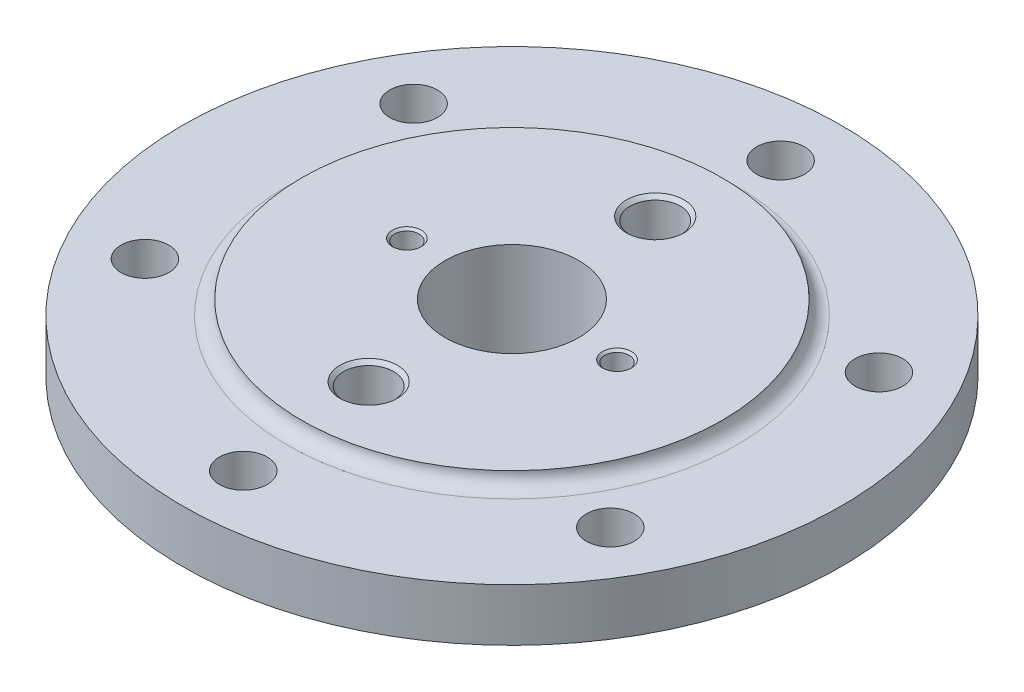
ISO-10303-21;
HEADER;
FILE_DESCRIPTION(('STEP AP214'),'2;1');
FILE_NAME('part.step','',(''),(''),'','','');
FILE_SCHEMA(('AUTOMOTIVE_DESIGN { 1 0 10303 214 1 1 1 1 }'));
ENDSEC;
DATA;
#1=APPLICATION_CONTEXT('core data for automotive mechanical design processes');
#2=APPLICATION_PROTOCOL_DEFINITION('international standard','automotive_design',2000,#1);
#3=PRODUCT_CONTEXT('',#1,'mechanical');
#4=PRODUCT('Part','Part','',(#3));
#5=PRODUCT_RELATED_PRODUCT_CATEGORY('part','',(#4));
#6=PRODUCT_DEFINITION_FORMATION('','',#4);
#7=PRODUCT_DEFINITION_CONTEXT('part definition',#1,'design');
#8=PRODUCT_DEFINITION('design','',#6,#7);
#9=PRODUCT_DEFINITION_SHAPE('','',#8);
#10=(LENGTH_UNIT() NAMED_UNIT(*) SI_UNIT(.MILLI.,.METRE.));
#11=(NAMED_UNIT(*) PLANE_ANGLE_UNIT() SI_UNIT($,.RADIAN.));
#12=(NAMED_UNIT(*) SI_UNIT($,.STERADIAN.) SOLID_ANGLE_UNIT());
#13=UNCERTAINTY_MEASURE_WITH_UNIT(LENGTH_MEASURE(1.E-05),#10,'distance_accuracy_value','');
#14=(GEOMETRIC_REPRESENTATION_CONTEXT(3) GLOBAL_UNCERTAINTY_ASSIGNED_CONTEXT((#13)) GLOBAL_UNIT_ASSIGNED_CONTEXT((#10,
#11,#12)) REPRESENTATION_CONTEXT('',''));
#15=CARTESIAN_POINT('',(0.,0.,0.));
#16=DIRECTION('',(0.,0.,1.));
#17=DIRECTION('',(1.,0.,0.));
#18=AXIS2_PLACEMENT_3D('',#15,#16,#17);
#19=CARTESIAN_POINT('',(-29.6935483870968,-6.7741935483871,0.));
#20=DIRECTION('',(0.,1.,0.));
#21=DIRECTION('',(-1.,0.,0.));
#22=AXIS2_PLACEMENT_3D('',#19,#20,#21);
#23=CONICAL_SURFACE('',#22,35.,0.774645889606347);
#24=CARTESIAN_POINT('',(-29.6935483870968,40.2258064516129,0.));
#25=DIRECTION('',(0.,1.,0.));
#26=DIRECTION('',(-1.,0.,0.));
#27=AXIS2_PLACEMENT_3D('',#24,#25,#26);
#28=CIRCLE('',#27,81.);
#29=CARTESIAN_POINT('',(-110.693548387097,40.2258064516129,0.));
#30=VERTEX_POINT('',#29);
#31=EDGE_CURVE('E11',#30,#30,#28,.T.);
#32=ORIENTED_EDGE('',*,*,#31,.F.);
#33=EDGE_LOOP('',(#32));
#34=FACE_BOUND('',#33,.T.);
#35=CARTESIAN_POINT('',(-29.6935483870968,-6.7741935483871,0.));
#36=DIRECTION('',(0.,1.,0.));
#37=DIRECTION('',(-1.,0.,0.));
#38=AXIS2_PLACEMENT_3D('',#35,#36,#37);
#39=CIRCLE('',#38,35.);
#40=CARTESIAN_POINT('',(-64.6935483870968,-6.77419354838711,0.));
#41=VERTEX_POINT('',#40);
#42=EDGE_CURVE('E139',#41,#41,#39,.T.);
#43=ORIENTED_EDGE('',*,*,#42,.T.);
#44=EDGE_LOOP('',(#43));
#45=FACE_BOUND('',#44,.T.);
#46=ADVANCED_FACE('F39',(#34,#45),#23,.T.);
#47=CARTESIAN_POINT('',(-29.6935483870968,26.3629032258064,0.));
#48=DIRECTION('',(0.,1.,0.));
#49=DIRECTION('',(-1.,0.,0.));
#50=AXIS2_PLACEMENT_3D('',#47,#48,#49);
#51=CYLINDRICAL_SURFACE('',#50,81.);
#52=CARTESIAN_POINT('',(-29.6935483870968,46.2258064516129,0.));
#53=DIRECTION('',(0.,1.,0.));
#54=DIRECTION('',(-1.,0.,0.));
#55=AXIS2_PLACEMENT_3D('',#52,#53,#54);
#56=CIRCLE('',#55,81.);
#57=CARTESIAN_POINT('',(-110.693548387097,46.2258064516129,0.));
#58=VERTEX_POINT('',#57);
#59=EDGE_CURVE('E46',#58,#58,#56,.T.);
#60=ORIENTED_EDGE('',*,*,#59,.F.);
#61=EDGE_LOOP('',(#60));
#62=FACE_BOUND('',#61,.T.);
#63=ORIENTED_EDGE('',*,*,#31,.T.);
#64=EDGE_LOOP('',(#63));
#65=FACE_BOUND('',#64,.T.);
#66=ADVANCED_FACE('F170',(#62,#65),#51,.T.);
#67=CARTESIAN_POINT('',(108.306451612903,46.2258064516129,0.));
#68=DIRECTION('',(0.,1.,0.));
#69=DIRECTION('',(-1.,0.,0.));
#70=AXIS2_PLACEMENT_3D('',#67,#68,#69);
#71=PLANE('',#70);
#72=CARTESIAN_POINT('',(-29.6935483870968,46.2258064516129,-112.5));
#73=DIRECTION('',(0.,1.,0.));
#74=DIRECTION('',(-1.,0.,0.));
#75=AXIS2_PLACEMENT_3D('',#72,#73,#74);
#76=CIRCLE('',#75,10.);
#77=CARTESIAN_POINT('',(-39.6935483870968,46.2258064516129,-112.5));
#78=VERTEX_POINT('',#77);
#79=EDGE_CURVE('E136',#78,#78,#76,.T.);
#80=ORIENTED_EDGE('',*,*,#79,.T.);
#81=EDGE_LOOP('',(#80));
#82=FACE_BOUND('',#81,.T.);
#83=CARTESIAN_POINT('',(-127.121406312844,46.2258064516129,-56.2499999999984));
#84=DIRECTION('',(0.,1.,0.));
#85=DIRECTION('',(-1.,0.,0.));
#86=AXIS2_PLACEMENT_3D('',#83,#84,#85);
#87=CIRCLE('',#86,9.99999999999998);
#88=CARTESIAN_POINT('',(-137.121406312844,46.2258064516129,-56.2499999999984));
#89=VERTEX_POINT('',#88);
#90=EDGE_CURVE('E133',#89,#89,#87,.T.);
#91=ORIENTED_EDGE('',*,*,#90,.T.);
#92=EDGE_LOOP('',(#91));
#93=FACE_BOUND('',#92,.T.);
#94=CARTESIAN_POINT('',(-127.121406312842,46.2258064516129,56.2500000000018));
#95=DIRECTION('',(0.,1.,0.));
#96=DIRECTION('',(-1.,0.,0.));
#97=AXIS2_PLACEMENT_3D('',#94,#95,#96);
#98=CIRCLE('',#97,10.);
#99=CARTESIAN_POINT('',(-137.121406312842,46.2258064516129,56.2500000000018));
#100=VERTEX_POINT('',#99);
#101=EDGE_CURVE('E130',#100,#100,#98,.T.);
#102=ORIENTED_EDGE('',*,*,#101,.T.);
#103=EDGE_LOOP('',(#102));
#104=FACE_BOUND('',#103,.T.);
#105=CARTESIAN_POINT('',(-29.6935483870912,46.2258064516129,112.5));
#106=DIRECTION('',(0.,1.,0.));
#107=DIRECTION('',(-1.,0.,0.));
#108=AXIS2_PLACEMENT_3D('',#105,#106,#107);
#109=CIRCLE('',#108,9.99999999999999);
#110=CARTESIAN_POINT('',(-39.6935483870912,46.2258064516129,112.5));
#111=VERTEX_POINT('',#110);
#112=EDGE_CURVE('E127',#111,#111,#109,.T.);
#113=ORIENTED_EDGE('',*,*,#112,.T.);
#114=EDGE_LOOP('',(#113));
#115=FACE_BOUND('',#114,.T.);
#116=CARTESIAN_POINT('',(67.7343095386571,46.2258064516129,56.2499999999977));
#117=DIRECTION('',(0.,1.,0.));
#118=DIRECTION('',(-1.,0.,0.));
#119=AXIS2_PLACEMENT_3D('',#116,#117,#118);
#120=CIRCLE('',#119,9.99999999999999);
#121=CARTESIAN_POINT('',(57.7343095386571,46.2258064516129,56.2499999999977));
#122=VERTEX_POINT('',#121);
#123=EDGE_CURVE('E124',#122,#122,#120,.T.);
#124=ORIENTED_EDGE('',*,*,#123,.T.);
#125=EDGE_LOOP('',(#124));
#126=FACE_BOUND('',#125,.T.);
#127=CARTESIAN_POINT('',(67.7343095386543,46.2258064516129,-56.2500000000025));
#128=DIRECTION('',(0.,1.,0.));
#129=DIRECTION('',(-1.,0.,0.));
#130=AXIS2_PLACEMENT_3D('',#127,#128,#129);
#131=CIRCLE('',#130,9.99999999999999);
#132=CARTESIAN_POINT('',(57.7343095386543,46.2258064516129,-56.2500000000025));
#133=VERTEX_POINT('',#132);
#134=EDGE_CURVE('E107',#133,#133,#131,.T.);
#135=ORIENTED_EDGE('',*,*,#134,.T.);
#136=EDGE_LOOP('',(#135));
#137=FACE_BOUND('',#136,.T.);
#138=CARTESIAN_POINT('',(-29.6935483870968,46.2258064516129,0.));
#139=DIRECTION('',(0.,1.,0.));
#140=DIRECTION('',(-1.,0.,0.));
#141=AXIS2_PLACEMENT_3D('',#138,#139,#140);
#142=CIRCLE('',#141,138.);
#143=CARTESIAN_POINT('',(-167.693548387097,46.2258064516129,0.));
#144=VERTEX_POINT('',#143);
#145=EDGE_CURVE('E163',#144,#144,#142,.T.);
#146=ORIENTED_EDGE('',*,*,#145,.F.);
#147=EDGE_LOOP('',(#146));
#148=FACE_BOUND('',#147,.T.);
#149=ORIENTED_EDGE('',*,*,#59,.T.);
#150=EDGE_LOOP('',(#149));
#151=FACE_BOUND('',#150,.T.);
#152=ADVANCED_FACE('F168',(#82,#93,#104,#115,#126,#137,#148,#151),#71,.F.);
#153=CARTESIAN_POINT('',(-29.6935483870968,26.3629032258064,0.));
#154=DIRECTION('',(0.,1.,0.));
#155=DIRECTION('',(-1.,0.,0.));
#156=AXIS2_PLACEMENT_3D('',#153,#154,#155);
#157=CYLINDRICAL_SURFACE('',#156,138.);
#158=CARTESIAN_POINT('',(-29.6935483870968,68.2258064516129,0.));
#159=DIRECTION('',(0.,1.,0.));
#160=DIRECTION('',(-1.,0.,0.));
#161=AXIS2_PLACEMENT_3D('',#158,#159,#160);
#162=CIRCLE('',#161,138.);
#163=CARTESIAN_POINT('',(-167.693548387097,68.2258064516129,0.));
#164=VERTEX_POINT('',#163);
#165=EDGE_CURVE('E160',#164,#164,#162,.T.);
#166=ORIENTED_EDGE('',*,*,#165,.F.);
#167=EDGE_LOOP('',(#166));
#168=FACE_BOUND('',#167,.T.);
#169=ORIENTED_EDGE('',*,*,#145,.T.);
#170=EDGE_LOOP('',(#169));
#171=FACE_BOUND('',#170,.T.);
#172=ADVANCED_FACE('F220',(#168,#171),#157,.T.);
#173=CARTESIAN_POINT('',(64.3064516129032,68.2258064516129,0.));
#174=DIRECTION('',(0.,-1.,0.));
#175=DIRECTION('',(1.,0.,0.));
#176=AXIS2_PLACEMENT_3D('',#173,#174,#175);
#177=PLANE('',#176);
#178=CARTESIAN_POINT('',(-29.6935483870968,68.2258064516129,-112.5));
#179=DIRECTION('',(0.,1.,0.));
#180=DIRECTION('',(-1.,0.,0.));
#181=AXIS2_PLACEMENT_3D('',#178,#179,#180);
#182=CIRCLE('',#181,10.);
#183=CARTESIAN_POINT('',(-39.6935483870968,68.2258064516129,-112.5));
#184=VERTEX_POINT('',#183);
#185=EDGE_CURVE('E104',#184,#184,#182,.T.);
#186=ORIENTED_EDGE('',*,*,#185,.F.);
#187=EDGE_LOOP('',(#186));
#188=FACE_BOUND('',#187,.T.);
#189=CARTESIAN_POINT('',(-127.121406312844,68.2258064516129,-56.2499999999984));
#190=DIRECTION('',(0.,1.,0.));
#191=DIRECTION('',(-1.,0.,0.));
#192=AXIS2_PLACEMENT_3D('',#189,#190,#191);
#193=CIRCLE('',#192,9.99999999999998);
#194=CARTESIAN_POINT('',(-137.121406312844,68.2258064516129,-56.2499999999984));
#195=VERTEX_POINT('',#194);
#196=EDGE_CURVE('E103',#195,#195,#193,.T.);
#197=ORIENTED_EDGE('',*,*,#196,.F.);
#198=EDGE_LOOP('',(#197));
#199=FACE_BOUND('',#198,.T.);
#200=CARTESIAN_POINT('',(-127.121406312842,68.2258064516129,56.2500000000018));
#201=DIRECTION('',(0.,1.,0.));
#202=DIRECTION('',(-1.,0.,0.));
#203=AXIS2_PLACEMENT_3D('',#200,#201,#202);
#204=CIRCLE('',#203,10.);
#205=CARTESIAN_POINT('',(-137.121406312842,68.2258064516129,56.2500000000018));
#206=VERTEX_POINT('',#205);
#207=EDGE_CURVE('E111',#206,#206,#204,.T.);
#208=ORIENTED_EDGE('',*,*,#207,.F.);
#209=EDGE_LOOP('',(#208));
#210=FACE_BOUND('',#209,.T.);
#211=CARTESIAN_POINT('',(-29.6935483870912,68.2258064516129,112.5));
#212=DIRECTION('',(0.,1.,0.));
#213=DIRECTION('',(-1.,0.,0.));
#214=AXIS2_PLACEMENT_3D('',#211,#212,#213);
#215=CIRCLE('',#214,9.99999999999999);
#216=CARTESIAN_POINT('',(-39.6935483870912,68.2258064516129,112.5));
#217=VERTEX_POINT('',#216);
#218=EDGE_CURVE('E117',#217,#217,#215,.T.);
#219=ORIENTED_EDGE('',*,*,#218,.F.);
#220=EDGE_LOOP('',(#219));
#221=FACE_BOUND('',#220,.T.);
#222=CARTESIAN_POINT('',(67.734309538657,68.2258064516129,56.2499999999977));
#223=DIRECTION('',(0.,1.,0.));
#224=DIRECTION('',(-1.,0.,0.));
#225=AXIS2_PLACEMENT_3D('',#222,#223,#224);
#226=CIRCLE('',#225,9.99999999999999);
#227=CARTESIAN_POINT('',(57.734309538657,68.2258064516129,56.2499999999977));
#228=VERTEX_POINT('',#227);
#229=EDGE_CURVE('E114',#228,#228,#226,.T.);
#230=ORIENTED_EDGE('',*,*,#229,.F.);
#231=EDGE_LOOP('',(#230));
#232=FACE_BOUND('',#231,.T.);
#233=CARTESIAN_POINT('',(67.7343095386543,68.2258064516129,-56.2500000000025));
#234=DIRECTION('',(0.,1.,0.));
#235=DIRECTION('',(-1.,0.,0.));
#236=AXIS2_PLACEMENT_3D('',#233,#234,#235);
#237=CIRCLE('',#236,9.99999999999999);
#238=CARTESIAN_POINT('',(57.7343095386543,68.2258064516129,-56.2500000000025));
#239=VERTEX_POINT('',#238);
#240=EDGE_CURVE('E108',#239,#239,#237,.T.);
#241=ORIENTED_EDGE('',*,*,#240,.F.);
#242=EDGE_LOOP('',(#241));
#243=FACE_BOUND('',#242,.T.);
#244=CARTESIAN_POINT('',(-29.6935483870968,68.2258064516129,0.));
#245=DIRECTION('',(0.,1.,0.));
#246=DIRECTION('',(-1.,0.,0.));
#247=AXIS2_PLACEMENT_3D('',#244,#245,#246);
#248=CIRCLE('',#247,94.);
#249=CARTESIAN_POINT('',(-123.693548387097,68.2258064516129,0.));
#250=VERTEX_POINT('',#249);
#251=EDGE_CURVE('E157',#250,#250,#248,.T.);
#252=ORIENTED_EDGE('',*,*,#251,.F.);
#253=EDGE_LOOP('',(#252));
#254=FACE_BOUND('',#253,.T.);
#255=ORIENTED_EDGE('',*,*,#165,.T.);
#256=EDGE_LOOP('',(#255));
#257=FACE_BOUND('',#256,.T.);
#258=ADVANCED_FACE('F214',(#188,#199,#210,#221,#232,#243,#254,#257),#177,.F.);
#259=CARTESIAN_POINT('',(-29.6935483870968,74.2258064516129,0.));
#260=DIRECTION('',(0.,1.,0.));
#261=DIRECTION('',(-1.,0.,0.));
#262=AXIS2_PLACEMENT_3D('',#259,#260,#261);
#263=TOROIDAL_SURFACE('',#262,94.,6.00000000000001);
#264=CARTESIAN_POINT('',(-29.6935483870968,74.2258064516129,0.));
#265=DIRECTION('',(0.,1.,0.));
#266=DIRECTION('',(-1.,0.,0.));
#267=AXIS2_PLACEMENT_3D('',#264,#265,#266);
#268=CIRCLE('',#267,88.);
#269=CARTESIAN_POINT('',(-117.693548387097,74.2258064516129,0.));
#270=VERTEX_POINT('',#269);
#271=EDGE_CURVE('E154',#270,#270,#268,.T.);
#272=ORIENTED_EDGE('',*,*,#271,.F.);
#273=EDGE_LOOP('',(#272));
#274=FACE_BOUND('',#273,.T.);
#275=ORIENTED_EDGE('',*,*,#251,.T.);
#276=EDGE_LOOP('',(#275));
#277=FACE_BOUND('',#276,.T.);
#278=ADVANCED_FACE('F207',(#274,#277),#263,.F.);
#279=CARTESIAN_POINT('',(-1.69354838709677,74.2258064516129,0.));
#280=DIRECTION('',(0.,-1.,0.));
#281=DIRECTION('',(1.,0.,0.));
#282=AXIS2_PLACEMENT_3D('',#279,#280,#281);
#283=PLANE('',#282);
#284=CARTESIAN_POINT('',(-73.6935483870968,74.2258064516129,0.));
#285=DIRECTION('',(0.,1.,0.));
#286=DIRECTION('',(0.,0.,1.));
#287=AXIS2_PLACEMENT_3D('',#284,#285,#286);
#288=CIRCLE('',#287,6.025);
#289=CARTESIAN_POINT('',(-73.6935483870968,74.2258064516129,6.02500000000001));
#290=VERTEX_POINT('',#289);
#291=EDGE_CURVE('E76',#290,#290,#288,.T.);
#292=ORIENTED_EDGE('',*,*,#291,.F.);
#293=EDGE_LOOP('',(#292));
#294=FACE_BOUND('',#293,.T.);
#295=CARTESIAN_POINT('',(14.3064516129032,74.2258064516129,0.));
#296=DIRECTION('',(0.,1.,0.));
#297=DIRECTION('',(0.,0.,1.));
#298=AXIS2_PLACEMENT_3D('',#295,#296,#297);
#299=CIRCLE('',#298,6.025);
#300=CARTESIAN_POINT('',(14.3064516129032,74.2258064516129,6.025));
#301=VERTEX_POINT('',#300);
#302=EDGE_CURVE('E69',#301,#301,#299,.T.);
#303=ORIENTED_EDGE('',*,*,#302,.F.);
#304=EDGE_LOOP('',(#303));
#305=FACE_BOUND('',#304,.T.);
#306=CARTESIAN_POINT('',(-29.6935483870968,74.2258064516129,60.));
#307=DIRECTION('',(0.,1.,0.));
#308=DIRECTION('',(0.,0.,1.));
#309=AXIS2_PLACEMENT_3D('',#306,#307,#308);
#310=CIRCLE('',#309,12.025);
#311=CARTESIAN_POINT('',(-29.6935483870968,74.2258064516129,72.025));
#312=VERTEX_POINT('',#311);
#313=EDGE_CURVE('E85',#312,#312,#310,.T.);
#314=ORIENTED_EDGE('',*,*,#313,.F.);
#315=EDGE_LOOP('',(#314));
#316=FACE_BOUND('',#315,.T.);
#317=CARTESIAN_POINT('',(-29.6935483870968,74.2258064516129,-60.));
#318=DIRECTION('',(0.,1.,0.));
#319=DIRECTION('',(0.,0.,1.));
#320=AXIS2_PLACEMENT_3D('',#317,#318,#319);
#321=CIRCLE('',#320,12.025);
#322=CARTESIAN_POINT('',(-29.6935483870968,74.2258064516129,-47.975));
#323=VERTEX_POINT('',#322);
#324=EDGE_CURVE('E94',#323,#323,#321,.T.);
#325=ORIENTED_EDGE('',*,*,#324,.F.);
#326=EDGE_LOOP('',(#325));
#327=FACE_BOUND('',#326,.T.);
#328=CARTESIAN_POINT('',(-29.6935483870968,74.2258064516129,0.));
#329=DIRECTION('',(0.,1.,0.));
#330=DIRECTION('',(-1.,0.,0.));
#331=AXIS2_PLACEMENT_3D('',#328,#329,#330);
#332=CIRCLE('',#331,28.);
#333=CARTESIAN_POINT('',(-57.6935483870968,74.2258064516129,0.));
#334=VERTEX_POINT('',#333);
#335=EDGE_CURVE('E151',#334,#334,#332,.T.);
#336=ORIENTED_EDGE('',*,*,#335,.F.);
#337=EDGE_LOOP('',(#336));
#338=FACE_BOUND('',#337,.T.);
#339=ORIENTED_EDGE('',*,*,#271,.T.);
#340=EDGE_LOOP('',(#339));
#341=FACE_BOUND('',#340,.T.);
#342=ADVANCED_FACE('F201',(#294,#305,#316,#327,#338,#341),#283,.F.);
#343=CARTESIAN_POINT('',(-29.6935483870968,26.3629032258064,0.));
#344=DIRECTION('',(0.,1.,0.));
#345=DIRECTION('',(-1.,0.,0.));
#346=AXIS2_PLACEMENT_3D('',#343,#344,#345);
#347=CYLINDRICAL_SURFACE('',#346,28.);
#348=CARTESIAN_POINT('',(-29.6935483870968,18.2258064516129,0.));
#349=DIRECTION('',(0.,1.,0.));
#350=DIRECTION('',(-1.,0.,0.));
#351=AXIS2_PLACEMENT_3D('',#348,#349,#350);
#352=CIRCLE('',#351,28.);
#353=CARTESIAN_POINT('',(-57.6935483870968,18.2258064516129,0.));
#354=VERTEX_POINT('',#353);
#355=EDGE_CURVE('E148',#354,#354,#352,.T.);
#356=ORIENTED_EDGE('',*,*,#355,.F.);
#357=EDGE_LOOP('',(#356));
#358=FACE_BOUND('',#357,.T.);
#359=ORIENTED_EDGE('',*,*,#335,.T.);
#360=EDGE_LOOP('',(#359));
#361=FACE_BOUND('',#360,.T.);
#362=ADVANCED_FACE('F195',(#358,#361),#347,.F.);
#363=CARTESIAN_POINT('',(-29.6935483870968,18.2258064516129,0.));
#364=DIRECTION('',(0.,1.,0.));
#365=DIRECTION('',(-1.,0.,0.));
#366=AXIS2_PLACEMENT_3D('',#363,#364,#365);
#367=CONICAL_SURFACE('',#366,28.,1.04719755119659);
#368=CARTESIAN_POINT('',(-29.6935483870968,10.1429026829581,0.));
#369=DIRECTION('',(0.,1.,0.));
#370=DIRECTION('',(-1.,0.,0.));
#371=AXIS2_PLACEMENT_3D('',#368,#369,#370);
#372=CIRCLE('',#371,14.);
#373=CARTESIAN_POINT('',(-43.6935483870968,10.1429026829581,0.));
#374=VERTEX_POINT('',#373);
#375=EDGE_CURVE('E145',#374,#374,#372,.T.);
#376=ORIENTED_EDGE('',*,*,#375,.F.);
#377=EDGE_LOOP('',(#376));
#378=FACE_BOUND('',#377,.T.);
#379=ORIENTED_EDGE('',*,*,#355,.T.);
#380=EDGE_LOOP('',(#379));
#381=FACE_BOUND('',#380,.T.);
#382=ADVANCED_FACE('F189',(#378,#381),#367,.F.);
#383=CARTESIAN_POINT('',(-29.6935483870968,26.3629032258064,0.));
#384=DIRECTION('',(0.,1.,0.));
#385=DIRECTION('',(-1.,0.,0.));
#386=AXIS2_PLACEMENT_3D('',#383,#384,#385);
#387=CYLINDRICAL_SURFACE('',#386,14.);
#388=CARTESIAN_POINT('',(-29.6935483870968,-6.7741935483871,0.));
#389=DIRECTION('',(0.,1.,0.));
#390=DIRECTION('',(-1.,0.,0.));
#391=AXIS2_PLACEMENT_3D('',#388,#389,#390);
#392=CIRCLE('',#391,14.);
#393=CARTESIAN_POINT('',(-43.6935483870968,-6.7741935483871,0.));
#394=VERTEX_POINT('',#393);
#395=EDGE_CURVE('E142',#394,#394,#392,.T.);
#396=ORIENTED_EDGE('',*,*,#395,.F.);
#397=EDGE_LOOP('',(#396));
#398=FACE_BOUND('',#397,.T.);
#399=ORIENTED_EDGE('',*,*,#375,.T.);
#400=EDGE_LOOP('',(#399));
#401=FACE_BOUND('',#400,.T.);
#402=ADVANCED_FACE('F183',(#398,#401),#387,.F.);
#403=CARTESIAN_POINT('',(5.30645161290323,-6.7741935483871,0.));
#404=DIRECTION('',(0.,1.,0.));
#405=DIRECTION('',(-1.,0.,0.));
#406=AXIS2_PLACEMENT_3D('',#403,#404,#405);
#407=PLANE('',#406);
#408=ORIENTED_EDGE('',*,*,#42,.F.);
#409=EDGE_LOOP('',(#408));
#410=FACE_BOUND('',#409,.T.);
#411=ORIENTED_EDGE('',*,*,#395,.T.);
#412=EDGE_LOOP('',(#411));
#413=FACE_BOUND('',#412,.T.);
#414=ADVANCED_FACE('F179',(#410,#413),#407,.F.);
#415=CARTESIAN_POINT('',(67.7343095386543,-6.77419354838711,-56.2500000000025));
#416=DIRECTION('',(0.,1.,0.));
#417=DIRECTION('',(-1.,0.,0.));
#418=AXIS2_PLACEMENT_3D('',#415,#416,#417);
#419=CYLINDRICAL_SURFACE('',#418,9.99999999999999);
#420=ORIENTED_EDGE('',*,*,#240,.T.);
#421=EDGE_LOOP('',(#420));
#422=FACE_BOUND('',#421,.T.);
#423=ORIENTED_EDGE('',*,*,#134,.F.);
#424=EDGE_LOOP('',(#423));
#425=FACE_BOUND('',#424,.T.);
#426=ADVANCED_FACE('F182',(#422,#425),#419,.F.);
#427=CARTESIAN_POINT('',(67.7343095386571,-6.77419354838711,56.2499999999977));
#428=DIRECTION('',(0.,1.,0.));
#429=DIRECTION('',(-1.,0.,0.));
#430=AXIS2_PLACEMENT_3D('',#427,#428,#429);
#431=CYLINDRICAL_SURFACE('',#430,9.99999999999999);
#432=ORIENTED_EDGE('',*,*,#229,.T.);
#433=EDGE_LOOP('',(#432));
#434=FACE_BOUND('',#433,.T.);
#435=ORIENTED_EDGE('',*,*,#123,.F.);
#436=EDGE_LOOP('',(#435));
#437=FACE_BOUND('',#436,.T.);
#438=ADVANCED_FACE('F245',(#434,#437),#431,.F.);
#439=CARTESIAN_POINT('',(-29.6935483870912,-6.77419354838713,112.5));
#440=DIRECTION('',(0.,1.,0.));
#441=DIRECTION('',(-1.,0.,0.));
#442=AXIS2_PLACEMENT_3D('',#439,#440,#441);
#443=CYLINDRICAL_SURFACE('',#442,9.99999999999999);
#444=ORIENTED_EDGE('',*,*,#218,.T.);
#445=EDGE_LOOP('',(#444));
#446=FACE_BOUND('',#445,.T.);
#447=ORIENTED_EDGE('',*,*,#112,.F.);
#448=EDGE_LOOP('',(#447));
#449=FACE_BOUND('',#448,.T.);
#450=ADVANCED_FACE('F241',(#446,#449),#443,.F.);
#451=CARTESIAN_POINT('',(-127.121406312842,-6.77419354838714,56.2500000000018));
#452=DIRECTION('',(0.,1.,0.));
#453=DIRECTION('',(-1.,0.,0.));
#454=AXIS2_PLACEMENT_3D('',#451,#452,#453);
#455=CYLINDRICAL_SURFACE('',#454,10.);
#456=ORIENTED_EDGE('',*,*,#207,.T.);
#457=EDGE_LOOP('',(#456));
#458=FACE_BOUND('',#457,.T.);
#459=ORIENTED_EDGE('',*,*,#101,.F.);
#460=EDGE_LOOP('',(#459));
#461=FACE_BOUND('',#460,.T.);
#462=ADVANCED_FACE('F237',(#458,#461),#455,.F.);
#463=CARTESIAN_POINT('',(-127.121406312844,-6.77419354838714,-56.2499999999984));
#464=DIRECTION('',(0.,1.,0.));
#465=DIRECTION('',(-1.,0.,0.));
#466=AXIS2_PLACEMENT_3D('',#463,#464,#465);
#467=CYLINDRICAL_SURFACE('',#466,9.99999999999998);
#468=ORIENTED_EDGE('',*,*,#196,.T.);
#469=EDGE_LOOP('',(#468));
#470=FACE_BOUND('',#469,.T.);
#471=ORIENTED_EDGE('',*,*,#90,.F.);
#472=EDGE_LOOP('',(#471));
#473=FACE_BOUND('',#472,.T.);
#474=ADVANCED_FACE('F240',(#470,#473),#467,.F.);
#475=CARTESIAN_POINT('',(-29.6935483870968,-6.77419354838713,-112.5));
#476=DIRECTION('',(0.,1.,0.));
#477=DIRECTION('',(-1.,0.,0.));
#478=AXIS2_PLACEMENT_3D('',#475,#476,#477);
#479=CYLINDRICAL_SURFACE('',#478,10.);
#480=ORIENTED_EDGE('',*,*,#185,.T.);
#481=EDGE_LOOP('',(#480));
#482=FACE_BOUND('',#481,.T.);
#483=ORIENTED_EDGE('',*,*,#79,.F.);
#484=EDGE_LOOP('',(#483));
#485=FACE_BOUND('',#484,.T.);
#486=ADVANCED_FACE('F255',(#482,#485),#479,.F.);
#487=CARTESIAN_POINT('',(-29.6935483870968,47.2258064516129,-60.));
#488=DIRECTION('',(0.,1.,0.));
#489=DIRECTION('',(0.,0.,1.));
#490=AXIS2_PLACEMENT_3D('',#487,#488,#489);
#491=CONICAL_SURFACE('',#490,10.5,1.02974425867665);
#492=CARTESIAN_POINT('',(-29.6935483870968,40.9167699518235,-60.));
#493=VERTEX_POINT('',#492);
#494=VERTEX_LOOP('',#493);
#495=FACE_BOUND('',#494,.T.);
#496=CARTESIAN_POINT('',(-29.6935483870968,47.2258064516129,-60.));
#497=DIRECTION('',(0.,1.,0.));
#498=DIRECTION('',(0.,0.,1.));
#499=AXIS2_PLACEMENT_3D('',#496,#497,#498);
#500=CIRCLE('',#499,10.5);
#501=CARTESIAN_POINT('',(-29.6935483870968,47.2258064516129,-49.5));
#502=VERTEX_POINT('',#501);
#503=EDGE_CURVE('E100',#502,#502,#500,.T.);
#504=ORIENTED_EDGE('',*,*,#503,.T.);
#505=EDGE_LOOP('',(#504));
#506=FACE_BOUND('',#505,.T.);
#507=ADVANCED_FACE('F259',(#495,#506),#491,.F.);
#508=CARTESIAN_POINT('',(-29.6935483870968,74.2258064516129,-60.));
#509=DIRECTION('',(0.,1.,0.));
#510=DIRECTION('',(0.,0.,1.));
#511=AXIS2_PLACEMENT_3D('',#508,#509,#510);
#512=CYLINDRICAL_SURFACE('',#511,10.5);
#513=ORIENTED_EDGE('',*,*,#503,.F.);
#514=EDGE_LOOP('',(#513));
#515=FACE_BOUND('',#514,.T.);
#516=CARTESIAN_POINT('',(-29.6935483870968,72.7008064516129,-60.));
#517=DIRECTION('',(0.,1.,0.));
#518=DIRECTION('',(0.,0.,1.));
#519=AXIS2_PLACEMENT_3D('',#516,#517,#518);
#520=CIRCLE('',#519,10.5);
#521=CARTESIAN_POINT('',(-29.6935483870968,72.7008064516129,-49.5));
#522=VERTEX_POINT('',#521);
#523=EDGE_CURVE('E97',#522,#522,#520,.T.);
#524=ORIENTED_EDGE('',*,*,#523,.T.);
#525=EDGE_LOOP('',(#524));
#526=FACE_BOUND('',#525,.T.);
#527=ADVANCED_FACE('F263',(#515,#526),#512,.F.);
#528=CARTESIAN_POINT('',(-29.6935483870968,74.2258064516129,-60.));
#529=DIRECTION('',(0.,1.,0.));
#530=DIRECTION('',(0.,0.,1.));
#531=AXIS2_PLACEMENT_3D('',#528,#529,#530);
#532=CONICAL_SURFACE('',#531,12.025,0.78539816339745);
#533=ORIENTED_EDGE('',*,*,#523,.F.);
#534=EDGE_LOOP('',(#533));
#535=FACE_BOUND('',#534,.T.);
#536=ORIENTED_EDGE('',*,*,#324,.T.);
#537=EDGE_LOOP('',(#536));
#538=FACE_BOUND('',#537,.T.);
#539=ADVANCED_FACE('F266',(#535,#538),#532,.F.);
#540=CARTESIAN_POINT('',(-29.6935483870968,47.2258064516129,60.));
#541=DIRECTION('',(0.,1.,0.));
#542=DIRECTION('',(0.,0.,1.));
#543=AXIS2_PLACEMENT_3D('',#540,#541,#542);
#544=CONICAL_SURFACE('',#543,10.5,1.02974425867665);
#545=CARTESIAN_POINT('',(-29.6935483870968,40.9167699518235,60.));
#546=VERTEX_POINT('',#545);
#547=VERTEX_LOOP('',#546);
#548=FACE_BOUND('',#547,.T.);
#549=CARTESIAN_POINT('',(-29.6935483870968,47.2258064516129,60.));
#550=DIRECTION('',(0.,1.,0.));
#551=DIRECTION('',(0.,0.,1.));
#552=AXIS2_PLACEMENT_3D('',#549,#550,#551);
#553=CIRCLE('',#552,10.5);
#554=CARTESIAN_POINT('',(-29.6935483870968,47.2258064516129,70.5));
#555=VERTEX_POINT('',#554);
#556=EDGE_CURVE('E91',#555,#555,#553,.T.);
#557=ORIENTED_EDGE('',*,*,#556,.T.);
#558=EDGE_LOOP('',(#557));
#559=FACE_BOUND('',#558,.T.);
#560=ADVANCED_FACE('F270',(#548,#559),#544,.F.);
#561=CARTESIAN_POINT('',(-29.6935483870968,74.2258064516129,60.));
#562=DIRECTION('',(0.,1.,0.));
#563=DIRECTION('',(0.,0.,1.));
#564=AXIS2_PLACEMENT_3D('',#561,#562,#563);
#565=CYLINDRICAL_SURFACE('',#564,10.5);
#566=ORIENTED_EDGE('',*,*,#556,.F.);
#567=EDGE_LOOP('',(#566));
#568=FACE_BOUND('',#567,.T.);
#569=CARTESIAN_POINT('',(-29.6935483870968,72.7008064516129,60.));
#570=DIRECTION('',(0.,1.,0.));
#571=DIRECTION('',(0.,0.,1.));
#572=AXIS2_PLACEMENT_3D('',#569,#570,#571);
#573=CIRCLE('',#572,10.5);
#574=CARTESIAN_POINT('',(-29.6935483870968,72.7008064516129,70.5));
#575=VERTEX_POINT('',#574);
#576=EDGE_CURVE('E88',#575,#575,#573,.T.);
#577=ORIENTED_EDGE('',*,*,#576,.T.);
#578=EDGE_LOOP('',(#577));
#579=FACE_BOUND('',#578,.T.);
#580=ADVANCED_FACE('F274',(#568,#579),#565,.F.);
#581=CARTESIAN_POINT('',(-29.6935483870968,74.2258064516129,60.));
#582=DIRECTION('',(0.,1.,0.));
#583=DIRECTION('',(0.,0.,1.));
#584=AXIS2_PLACEMENT_3D('',#581,#582,#583);
#585=CONICAL_SURFACE('',#584,12.025,0.78539816339745);
#586=ORIENTED_EDGE('',*,*,#576,.F.);
#587=EDGE_LOOP('',(#586));
#588=FACE_BOUND('',#587,.T.);
#589=ORIENTED_EDGE('',*,*,#313,.T.);
#590=EDGE_LOOP('',(#589));
#591=FACE_BOUND('',#590,.T.);
#592=ADVANCED_FACE('F277',(#588,#591),#585,.F.);
#593=CARTESIAN_POINT('',(14.3064516129032,56.9758064516129,0.));
#594=DIRECTION('',(0.,1.,0.));
#595=DIRECTION('',(0.,0.,1.));
#596=AXIS2_PLACEMENT_3D('',#593,#594,#595);
#597=CONICAL_SURFACE('',#596,5.09999999999999,1.02974425867665);
#598=CARTESIAN_POINT('',(14.3064516129032,53.9114172945724,0.));
#599=VERTEX_POINT('',#598);
#600=VERTEX_LOOP('',#599);
#601=FACE_BOUND('',#600,.T.);
#602=CARTESIAN_POINT('',(14.3064516129032,56.9758064516129,0.));
#603=DIRECTION('',(0.,1.,0.));
#604=DIRECTION('',(0.,0.,1.));
#605=AXIS2_PLACEMENT_3D('',#602,#603,#604);
#606=CIRCLE('',#605,5.09999999999999);
#607=CARTESIAN_POINT('',(14.3064516129032,56.9758064516129,5.09999999999999));
#608=VERTEX_POINT('',#607);
#609=EDGE_CURVE('E82',#608,#608,#606,.T.);
#610=ORIENTED_EDGE('',*,*,#609,.T.);
#611=EDGE_LOOP('',(#610));
#612=FACE_BOUND('',#611,.T.);
#613=ADVANCED_FACE('F281',(#601,#612),#597,.F.);
#614=CARTESIAN_POINT('',(14.3064516129032,74.2258064516129,0.));
#615=DIRECTION('',(0.,1.,0.));
#616=DIRECTION('',(0.,0.,1.));
#617=AXIS2_PLACEMENT_3D('',#614,#615,#616);
#618=CYLINDRICAL_SURFACE('',#617,5.1);
#619=ORIENTED_EDGE('',*,*,#609,.F.);
#620=EDGE_LOOP('',(#619));
#621=FACE_BOUND('',#620,.T.);
#622=CARTESIAN_POINT('',(14.3064516129032,73.3008064516129,0.));
#623=DIRECTION('',(0.,1.,0.));
#624=DIRECTION('',(0.,0.,1.));
#625=AXIS2_PLACEMENT_3D('',#622,#623,#624);
#626=CIRCLE('',#625,5.1);
#627=CARTESIAN_POINT('',(14.3064516129032,73.3008064516129,5.1));
#628=VERTEX_POINT('',#627);
#629=EDGE_CURVE('E73',#628,#628,#626,.T.);
#630=ORIENTED_EDGE('',*,*,#629,.T.);
#631=EDGE_LOOP('',(#630));
#632=FACE_BOUND('',#631,.T.);
#633=ADVANCED_FACE('F285',(#621,#632),#618,.F.);
#634=CARTESIAN_POINT('',(14.3064516129032,74.2258064516129,0.));
#635=DIRECTION('',(0.,1.,0.));
#636=DIRECTION('',(0.,0.,1.));
#637=AXIS2_PLACEMENT_3D('',#634,#635,#636);
#638=CONICAL_SURFACE('',#637,6.025,0.785398163397445);
#639=ORIENTED_EDGE('',*,*,#629,.F.);
#640=EDGE_LOOP('',(#639));
#641=FACE_BOUND('',#640,.T.);
#642=ORIENTED_EDGE('',*,*,#302,.T.);
#643=EDGE_LOOP('',(#642));
#644=FACE_BOUND('',#643,.T.);
#645=ADVANCED_FACE('F63',(#641,#644),#638,.F.);
#646=CARTESIAN_POINT('',(-73.6935483870968,56.9758064516129,0.));
#647=DIRECTION('',(0.,1.,0.));
#648=DIRECTION('',(0.,0.,1.));
#649=AXIS2_PLACEMENT_3D('',#646,#647,#648);
#650=CONICAL_SURFACE('',#649,5.09999999999999,1.02974425867665);
#651=CARTESIAN_POINT('',(-73.6935483870968,53.9114172945723,0.));
#652=VERTEX_POINT('',#651);
#653=VERTEX_LOOP('',#652);
#654=FACE_BOUND('',#653,.T.);
#655=CARTESIAN_POINT('',(-73.6935483870968,56.9758064516129,0.));
#656=DIRECTION('',(0.,1.,0.));
#657=DIRECTION('',(0.,0.,1.));
#658=AXIS2_PLACEMENT_3D('',#655,#656,#657);
#659=CIRCLE('',#658,5.09999999999999);
#660=CARTESIAN_POINT('',(-73.6935483870968,56.9758064516129,5.1));
#661=VERTEX_POINT('',#660);
#662=EDGE_CURVE('E67',#661,#661,#659,.T.);
#663=ORIENTED_EDGE('',*,*,#662,.T.);
#664=EDGE_LOOP('',(#663));
#665=FACE_BOUND('',#664,.T.);
#666=ADVANCED_FACE('F59',(#654,#665),#650,.F.);
#667=CARTESIAN_POINT('',(-73.6935483870968,74.2258064516129,0.));
#668=DIRECTION('',(0.,1.,0.));
#669=DIRECTION('',(0.,0.,1.));
#670=AXIS2_PLACEMENT_3D('',#667,#668,#669);
#671=CYLINDRICAL_SURFACE('',#670,5.09999999999999);
#672=ORIENTED_EDGE('',*,*,#662,.F.);
#673=EDGE_LOOP('',(#672));
#674=FACE_BOUND('',#673,.T.);
#675=CARTESIAN_POINT('',(-73.6935483870968,73.3008064516129,0.));
#676=DIRECTION('',(0.,1.,0.));
#677=DIRECTION('',(0.,0.,1.));
#678=AXIS2_PLACEMENT_3D('',#675,#676,#677);
#679=CIRCLE('',#678,5.09999999999999);
#680=CARTESIAN_POINT('',(-73.6935483870968,73.3008064516129,5.1));
#681=VERTEX_POINT('',#680);
#682=EDGE_CURVE('E70',#681,#681,#679,.T.);
#683=ORIENTED_EDGE('',*,*,#682,.T.);
#684=EDGE_LOOP('',(#683));
#685=FACE_BOUND('',#684,.T.);
#686=ADVANCED_FACE('F62',(#674,#685),#671,.F.);
#687=CARTESIAN_POINT('',(-73.6935483870968,74.2258064516129,0.));
#688=DIRECTION('',(0.,1.,0.));
#689=DIRECTION('',(0.,0.,1.));
#690=AXIS2_PLACEMENT_3D('',#687,#688,#689);
#691=CONICAL_SURFACE('',#690,6.025,0.785398163397448);
#692=ORIENTED_EDGE('',*,*,#682,.F.);
#693=EDGE_LOOP('',(#692));
#694=FACE_BOUND('',#693,.T.);
#695=ORIENTED_EDGE('',*,*,#291,.T.);
#696=EDGE_LOOP('',(#695));
#697=FACE_BOUND('',#696,.T.);
#698=ADVANCED_FACE('F295',(#694,#697),#691,.F.);
#699=CLOSED_SHELL('',(#46,#66,#152,#172,#258,#278,#342,#362,#382,#402,#414,#426,#438,#450,#462,
#474,#486,#507,#527,#539,#560,#580,#592,#613,#633,#645,#666,#686,#698));
#700=MANIFOLD_SOLID_BREP('B2',#699);
#701=ADVANCED_BREP_SHAPE_REPRESENTATION('',(#18,#700),#14);
#702=SHAPE_DEFINITION_REPRESENTATION(#9,#701);
ENDSEC;
END-ISO-10303-21;
